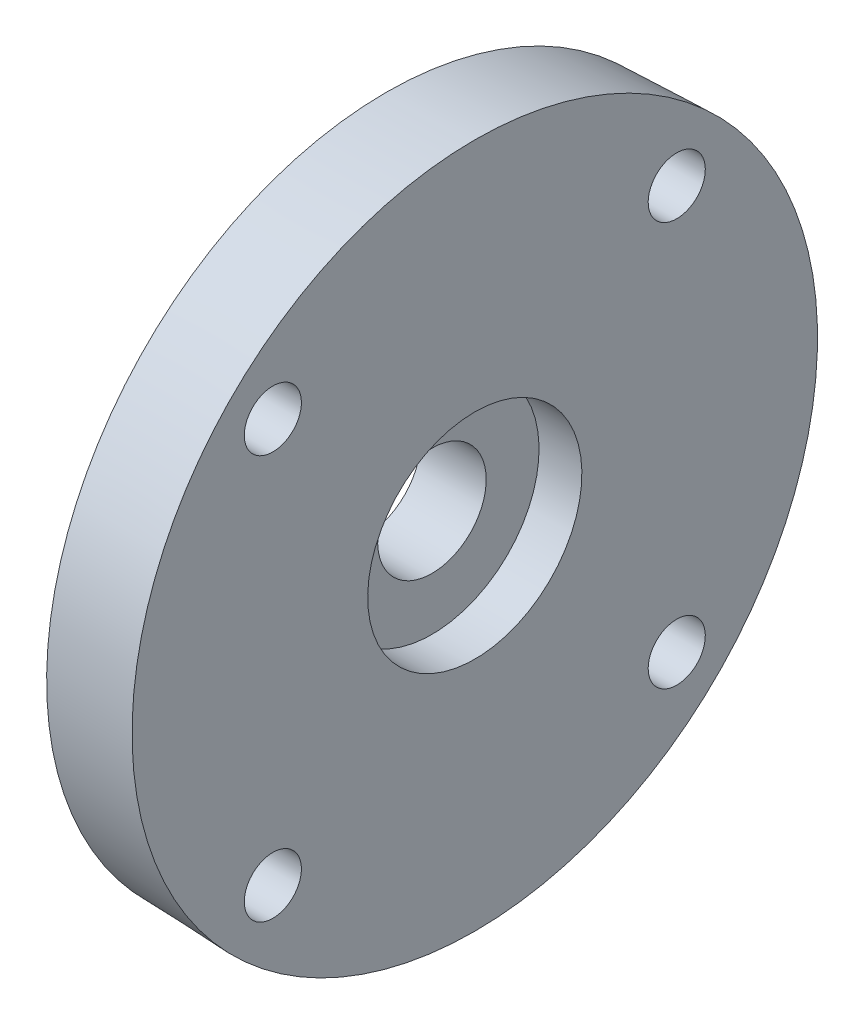
ISO-10303-21;
HEADER;
FILE_DESCRIPTION(('STEP AP214'),'2;1');
FILE_NAME('part.step','',(''),(''),'','','');
FILE_SCHEMA(('AUTOMOTIVE_DESIGN { 1 0 10303 214 1 1 1 1 }'));
ENDSEC;
DATA;
#1=APPLICATION_CONTEXT('core data for automotive mechanical design processes');
#2=APPLICATION_PROTOCOL_DEFINITION('international standard','automotive_design',2000,#1);
#3=PRODUCT_CONTEXT('',#1,'mechanical');
#4=PRODUCT('Part','Part','',(#3));
#5=PRODUCT_RELATED_PRODUCT_CATEGORY('part','',(#4));
#6=PRODUCT_DEFINITION_FORMATION('','',#4);
#7=PRODUCT_DEFINITION_CONTEXT('part definition',#1,'design');
#8=PRODUCT_DEFINITION('design','',#6,#7);
#9=PRODUCT_DEFINITION_SHAPE('','',#8);
#10=(LENGTH_UNIT() NAMED_UNIT(*) SI_UNIT(.MILLI.,.METRE.));
#11=(NAMED_UNIT(*) PLANE_ANGLE_UNIT() SI_UNIT($,.RADIAN.));
#12=(NAMED_UNIT(*) SI_UNIT($,.STERADIAN.) SOLID_ANGLE_UNIT());
#13=UNCERTAINTY_MEASURE_WITH_UNIT(LENGTH_MEASURE(1.E-05),#10,'distance_accuracy_value','');
#14=(GEOMETRIC_REPRESENTATION_CONTEXT(3) GLOBAL_UNCERTAINTY_ASSIGNED_CONTEXT((#13)) GLOBAL_UNIT_ASSIGNED_CONTEXT((#10,
#11,#12)) REPRESENTATION_CONTEXT('',''));
#15=CARTESIAN_POINT('',(0.,0.,0.));
#16=DIRECTION('',(0.,0.,1.));
#17=DIRECTION('',(1.,0.,0.));
#18=AXIS2_PLACEMENT_3D('',#15,#16,#17);
#19=CARTESIAN_POINT('',(0.,0.,0.));
#20=DIRECTION('',(1.,0.,0.));
#21=DIRECTION('',(0.,1.,0.));
#22=AXIS2_PLACEMENT_3D('',#19,#20,#21);
#23=CYLINDRICAL_SURFACE('',#22,4.826);
#24=CARTESIAN_POINT('',(-9.652,0.,0.));
#25=DIRECTION('',(1.,0.,0.));
#26=DIRECTION('',(0.,1.,0.));
#27=AXIS2_PLACEMENT_3D('',#24,#25,#26);
#28=CIRCLE('',#27,4.826);
#29=CARTESIAN_POINT('',(-9.652,4.826,0.));
#30=VERTEX_POINT('',#29);
#31=EDGE_CURVE('E39',#30,#30,#28,.T.);
#32=ORIENTED_EDGE('',*,*,#31,.F.);
#33=EDGE_LOOP('',(#32));
#34=FACE_BOUND('',#33,.T.);
#35=CARTESIAN_POINT('',(-3.81,0.,0.));
#36=DIRECTION('',(1.,0.,0.));
#37=DIRECTION('',(0.,1.,0.));
#38=AXIS2_PLACEMENT_3D('',#35,#36,#37);
#39=CIRCLE('',#38,4.826);
#40=CARTESIAN_POINT('',(-3.81,4.826,0.));
#41=VERTEX_POINT('',#40);
#42=EDGE_CURVE('E35',#41,#41,#39,.T.);
#43=ORIENTED_EDGE('',*,*,#42,.T.);
#44=EDGE_LOOP('',(#43));
#45=FACE_BOUND('',#44,.T.);
#46=ADVANCED_FACE('F31',(#34,#45),#23,.F.);
#47=CARTESIAN_POINT('',(0.,0.,0.));
#48=DIRECTION('',(1.,0.,0.));
#49=DIRECTION('',(0.,1.,0.));
#50=AXIS2_PLACEMENT_3D('',#47,#48,#49);
#51=CONICAL_SURFACE('',#50,30.48,0.03490658503988);
#52=CARTESIAN_POINT('',(-7.874,0.,0.));
#53=DIRECTION('',(1.,0.,0.));
#54=DIRECTION('',(0.,1.,0.));
#55=AXIS2_PLACEMENT_3D('',#52,#53,#54);
#56=CIRCLE('',#55,30.205033861022);
#57=CARTESIAN_POINT('',(-7.874,30.205033861022,0.));
#58=VERTEX_POINT('',#57);
#59=EDGE_CURVE('E51',#58,#58,#56,.T.);
#60=ORIENTED_EDGE('',*,*,#59,.T.);
#61=EDGE_LOOP('',(#60));
#62=FACE_BOUND('',#61,.T.);
#63=CARTESIAN_POINT('',(0.,0.,0.));
#64=DIRECTION('',(1.,0.,0.));
#65=DIRECTION('',(0.,1.,0.));
#66=AXIS2_PLACEMENT_3D('',#63,#64,#65);
#67=CIRCLE('',#66,30.48);
#68=CARTESIAN_POINT('',(0.,30.48,0.));
#69=VERTEX_POINT('',#68);
#70=EDGE_CURVE('E10',#69,#69,#67,.T.);
#71=ORIENTED_EDGE('',*,*,#70,.F.);
#72=EDGE_LOOP('',(#71));
#73=FACE_BOUND('',#72,.T.);
#74=ADVANCED_FACE('F33',(#62,#73),#51,.T.);
#75=CARTESIAN_POINT('',(0.,30.48,0.));
#76=DIRECTION('',(1.,0.,0.));
#77=DIRECTION('',(0.,1.,0.));
#78=AXIS2_PLACEMENT_3D('',#75,#76,#77);
#79=PLANE('',#78);
#80=CARTESIAN_POINT('',(0.,0.,0.));
#81=DIRECTION('',(1.,0.,0.));
#82=DIRECTION('',(0.,1.,0.));
#83=AXIS2_PLACEMENT_3D('',#80,#81,#82);
#84=CIRCLE('',#83,9.525);
#85=CARTESIAN_POINT('',(0.,9.525,0.));
#86=VERTEX_POINT('',#85);
#87=EDGE_CURVE('E78',#86,#86,#84,.T.);
#88=ORIENTED_EDGE('',*,*,#87,.F.);
#89=EDGE_LOOP('',(#88));
#90=FACE_BOUND('',#89,.T.);
#91=CARTESIAN_POINT('',(0.,17.9605122421383,-17.9605122421383));
#92=DIRECTION('',(-1.,0.,0.));
#93=DIRECTION('',(0.,-1.,0.));
#94=AXIS2_PLACEMENT_3D('',#91,#92,#93);
#95=CIRCLE('',#94,2.54);
#96=CARTESIAN_POINT('',(0.,15.4205122421383,-17.9605122421383));
#97=VERTEX_POINT('',#96);
#98=EDGE_CURVE('E58',#97,#97,#95,.T.);
#99=ORIENTED_EDGE('',*,*,#98,.T.);
#100=EDGE_LOOP('',(#99));
#101=FACE_BOUND('',#100,.T.);
#102=CARTESIAN_POINT('',(0.,-17.9605122421383,17.9605122421383));
#103=DIRECTION('',(-1.,0.,0.));
#104=DIRECTION('',(0.,-1.,0.));
#105=AXIS2_PLACEMENT_3D('',#102,#103,#104);
#106=CIRCLE('',#105,2.54);
#107=CARTESIAN_POINT('',(0.,-20.5005122421383,17.9605122421383));
#108=VERTEX_POINT('',#107);
#109=EDGE_CURVE('E64',#108,#108,#106,.T.);
#110=ORIENTED_EDGE('',*,*,#109,.T.);
#111=EDGE_LOOP('',(#110));
#112=FACE_BOUND('',#111,.T.);
#113=CARTESIAN_POINT('',(0.,-17.9605122421383,-17.9605122421383));
#114=DIRECTION('',(-1.,0.,0.));
#115=DIRECTION('',(0.,-1.,0.));
#116=AXIS2_PLACEMENT_3D('',#113,#114,#115);
#117=CIRCLE('',#116,2.54);
#118=CARTESIAN_POINT('',(0.,-20.5005122421383,-17.9605122421383));
#119=VERTEX_POINT('',#118);
#120=EDGE_CURVE('E65',#119,#119,#117,.T.);
#121=ORIENTED_EDGE('',*,*,#120,.T.);
#122=EDGE_LOOP('',(#121));
#123=FACE_BOUND('',#122,.T.);
#124=CARTESIAN_POINT('',(0.,17.9605122421383,17.9605122421383));
#125=DIRECTION('',(-1.,0.,0.));
#126=DIRECTION('',(0.,-1.,0.));
#127=AXIS2_PLACEMENT_3D('',#124,#125,#126);
#128=CIRCLE('',#127,2.54);
#129=CARTESIAN_POINT('',(0.,15.4205122421383,17.9605122421383));
#130=VERTEX_POINT('',#129);
#131=EDGE_CURVE('E54',#130,#130,#128,.T.);
#132=ORIENTED_EDGE('',*,*,#131,.T.);
#133=EDGE_LOOP('',(#132));
#134=FACE_BOUND('',#133,.T.);
#135=ORIENTED_EDGE('',*,*,#70,.T.);
#136=EDGE_LOOP('',(#135));
#137=FACE_BOUND('',#136,.T.);
#138=ADVANCED_FACE('F105',(#90,#101,#112,#123,#134,#137),#79,.T.);
#139=CARTESIAN_POINT('',(-9.652,8.255,0.));
#140=DIRECTION('',(-1.,0.,0.));
#141=DIRECTION('',(0.,-1.,0.));
#142=AXIS2_PLACEMENT_3D('',#139,#140,#141);
#143=PLANE('',#142);
#144=ORIENTED_EDGE('',*,*,#31,.T.);
#145=EDGE_LOOP('',(#144));
#146=FACE_BOUND('',#145,.T.);
#147=CARTESIAN_POINT('',(-9.652,0.,0.));
#148=DIRECTION('',(1.,0.,0.));
#149=DIRECTION('',(0.,1.,0.));
#150=AXIS2_PLACEMENT_3D('',#147,#148,#149);
#151=CIRCLE('',#150,8.255);
#152=CARTESIAN_POINT('',(-9.652,8.255,0.));
#153=VERTEX_POINT('',#152);
#154=EDGE_CURVE('E43',#153,#153,#151,.T.);
#155=ORIENTED_EDGE('',*,*,#154,.F.);
#156=EDGE_LOOP('',(#155));
#157=FACE_BOUND('',#156,.T.);
#158=ADVANCED_FACE('F109',(#146,#157),#143,.T.);
#159=CARTESIAN_POINT('',(0.,0.,0.));
#160=DIRECTION('',(1.,0.,0.));
#161=DIRECTION('',(0.,1.,0.));
#162=AXIS2_PLACEMENT_3D('',#159,#160,#161);
#163=CYLINDRICAL_SURFACE('',#162,8.255);
#164=ORIENTED_EDGE('',*,*,#154,.T.);
#165=EDGE_LOOP('',(#164));
#166=FACE_BOUND('',#165,.T.);
#167=CARTESIAN_POINT('',(-7.874,0.,0.));
#168=DIRECTION('',(1.,0.,0.));
#169=DIRECTION('',(0.,1.,0.));
#170=AXIS2_PLACEMENT_3D('',#167,#168,#169);
#171=CIRCLE('',#170,8.255);
#172=CARTESIAN_POINT('',(-7.874,8.255,0.));
#173=VERTEX_POINT('',#172);
#174=EDGE_CURVE('E48',#173,#173,#171,.T.);
#175=ORIENTED_EDGE('',*,*,#174,.F.);
#176=EDGE_LOOP('',(#175));
#177=FACE_BOUND('',#176,.T.);
#178=ADVANCED_FACE('F116',(#166,#177),#163,.T.);
#179=CARTESIAN_POINT('',(-7.874,8.255,0.));
#180=DIRECTION('',(-1.,0.,0.));
#181=DIRECTION('',(0.,-1.,0.));
#182=AXIS2_PLACEMENT_3D('',#179,#180,#181);
#183=PLANE('',#182);
#184=CARTESIAN_POINT('',(-7.874,17.9605122421383,-17.9605122421383));
#185=DIRECTION('',(-1.,0.,0.));
#186=DIRECTION('',(0.,-1.,0.));
#187=AXIS2_PLACEMENT_3D('',#184,#185,#186);
#188=CIRCLE('',#187,2.54);
#189=CARTESIAN_POINT('',(-7.874,15.4205122421383,-17.9605122421383));
#190=VERTEX_POINT('',#189);
#191=EDGE_CURVE('E68',#190,#190,#188,.T.);
#192=ORIENTED_EDGE('',*,*,#191,.F.);
#193=EDGE_LOOP('',(#192));
#194=FACE_BOUND('',#193,.T.);
#195=CARTESIAN_POINT('',(-7.87399999999999,-17.9605122421383,17.9605122421383));
#196=DIRECTION('',(-1.,0.,0.));
#197=DIRECTION('',(0.,-1.,0.));
#198=AXIS2_PLACEMENT_3D('',#195,#196,#197);
#199=CIRCLE('',#198,2.54);
#200=CARTESIAN_POINT('',(-7.87399999999999,-20.5005122421383,17.9605122421383));
#201=VERTEX_POINT('',#200);
#202=EDGE_CURVE('E61',#201,#201,#199,.T.);
#203=ORIENTED_EDGE('',*,*,#202,.F.);
#204=EDGE_LOOP('',(#203));
#205=FACE_BOUND('',#204,.T.);
#206=CARTESIAN_POINT('',(-7.87399999999999,-17.9605122421383,-17.9605122421383));
#207=DIRECTION('',(-1.,0.,0.));
#208=DIRECTION('',(0.,-1.,0.));
#209=AXIS2_PLACEMENT_3D('',#206,#207,#208);
#210=CIRCLE('',#209,2.54);
#211=CARTESIAN_POINT('',(-7.87399999999999,-20.5005122421383,-17.9605122421383));
#212=VERTEX_POINT('',#211);
#213=EDGE_CURVE('E73',#212,#212,#210,.T.);
#214=ORIENTED_EDGE('',*,*,#213,.F.);
#215=EDGE_LOOP('',(#214));
#216=FACE_BOUND('',#215,.T.);
#217=CARTESIAN_POINT('',(-7.874,17.9605122421383,17.9605122421383));
#218=DIRECTION('',(-1.,0.,0.));
#219=DIRECTION('',(0.,-1.,0.));
#220=AXIS2_PLACEMENT_3D('',#217,#218,#219);
#221=CIRCLE('',#220,2.54);
#222=CARTESIAN_POINT('',(-7.874,15.4205122421383,17.9605122421383));
#223=VERTEX_POINT('',#222);
#224=EDGE_CURVE('E55',#223,#223,#221,.T.);
#225=ORIENTED_EDGE('',*,*,#224,.F.);
#226=EDGE_LOOP('',(#225));
#227=FACE_BOUND('',#226,.T.);
#228=ORIENTED_EDGE('',*,*,#174,.T.);
#229=EDGE_LOOP('',(#228));
#230=FACE_BOUND('',#229,.T.);
#231=ORIENTED_EDGE('',*,*,#59,.F.);
#232=EDGE_LOOP('',(#231));
#233=FACE_BOUND('',#232,.T.);
#234=ADVANCED_FACE('F132',(#194,#205,#216,#227,#230,#233),#183,.T.);
#235=CARTESIAN_POINT('',(0.,17.9605122421383,17.9605122421383));
#236=DIRECTION('',(-1.,0.,0.));
#237=DIRECTION('',(0.,-1.,0.));
#238=AXIS2_PLACEMENT_3D('',#235,#236,#237);
#239=CYLINDRICAL_SURFACE('',#238,2.54);
#240=ORIENTED_EDGE('',*,*,#131,.F.);
#241=EDGE_LOOP('',(#240));
#242=FACE_BOUND('',#241,.T.);
#243=ORIENTED_EDGE('',*,*,#224,.T.);
#244=EDGE_LOOP('',(#243));
#245=FACE_BOUND('',#244,.T.);
#246=ADVANCED_FACE('F128',(#242,#245),#239,.F.);
#247=CARTESIAN_POINT('',(0.,-17.9605122421383,-17.9605122421383));
#248=DIRECTION('',(-1.,0.,0.));
#249=DIRECTION('',(0.,-1.,0.));
#250=AXIS2_PLACEMENT_3D('',#247,#248,#249);
#251=CYLINDRICAL_SURFACE('',#250,2.54);
#252=ORIENTED_EDGE('',*,*,#120,.F.);
#253=EDGE_LOOP('',(#252));
#254=FACE_BOUND('',#253,.T.);
#255=ORIENTED_EDGE('',*,*,#213,.T.);
#256=EDGE_LOOP('',(#255));
#257=FACE_BOUND('',#256,.T.);
#258=ADVANCED_FACE('F131',(#254,#257),#251,.F.);
#259=CARTESIAN_POINT('',(0.,-17.9605122421383,17.9605122421383));
#260=DIRECTION('',(-1.,0.,0.));
#261=DIRECTION('',(0.,-1.,0.));
#262=AXIS2_PLACEMENT_3D('',#259,#260,#261);
#263=CYLINDRICAL_SURFACE('',#262,2.54);
#264=ORIENTED_EDGE('',*,*,#109,.F.);
#265=EDGE_LOOP('',(#264));
#266=FACE_BOUND('',#265,.T.);
#267=ORIENTED_EDGE('',*,*,#202,.T.);
#268=EDGE_LOOP('',(#267));
#269=FACE_BOUND('',#268,.T.);
#270=ADVANCED_FACE('F150',(#266,#269),#263,.F.);
#271=CARTESIAN_POINT('',(0.,17.9605122421383,-17.9605122421383));
#272=DIRECTION('',(-1.,0.,0.));
#273=DIRECTION('',(0.,-1.,0.));
#274=AXIS2_PLACEMENT_3D('',#271,#272,#273);
#275=CYLINDRICAL_SURFACE('',#274,2.54);
#276=ORIENTED_EDGE('',*,*,#98,.F.);
#277=EDGE_LOOP('',(#276));
#278=FACE_BOUND('',#277,.T.);
#279=ORIENTED_EDGE('',*,*,#191,.T.);
#280=EDGE_LOOP('',(#279));
#281=FACE_BOUND('',#280,.T.);
#282=ADVANCED_FACE('F96',(#278,#281),#275,.F.);
#283=CARTESIAN_POINT('',(-3.81,0.,0.));
#284=DIRECTION('',(1.,0.,0.));
#285=DIRECTION('',(0.,1.,0.));
#286=AXIS2_PLACEMENT_3D('',#283,#284,#285);
#287=CYLINDRICAL_SURFACE('',#286,9.525);
#288=CARTESIAN_POINT('',(-3.81,0.,0.));
#289=DIRECTION('',(1.,0.,0.));
#290=DIRECTION('',(0.,1.,0.));
#291=AXIS2_PLACEMENT_3D('',#288,#289,#290);
#292=CIRCLE('',#291,9.525);
#293=CARTESIAN_POINT('',(-3.81,9.525,0.));
#294=VERTEX_POINT('',#293);
#295=EDGE_CURVE('E81',#294,#294,#292,.T.);
#296=CARTESIAN_POINT('',(-3.81,9.525,0.));
#297=CARTESIAN_POINT('',(-3.7703125,9.525,0.));
#298=CARTESIAN_POINT('',(-3.730625,9.525,0.));
#299=CARTESIAN_POINT('',(-3.65125,9.525,0.));
#300=CARTESIAN_POINT('',(-3.6115625,9.525,0.));
#301=CARTESIAN_POINT('',(-3.5321875,9.525,0.));
#302=CARTESIAN_POINT('',(-3.4925,9.525,0.));
#303=CARTESIAN_POINT('',(-3.413125,9.525,0.));
#304=CARTESIAN_POINT('',(-3.3734375,9.525,0.));
#305=CARTESIAN_POINT('',(-3.2940625,9.525,0.));
#306=CARTESIAN_POINT('',(-3.254375,9.525,0.));
#307=CARTESIAN_POINT('',(-3.175,9.525,0.));
#308=CARTESIAN_POINT('',(-3.1353125,9.525,0.));
#309=CARTESIAN_POINT('',(-3.0559375,9.525,0.));
#310=CARTESIAN_POINT('',(-3.01625,9.525,0.));
#311=CARTESIAN_POINT('',(-2.936875,9.525,0.));
#312=CARTESIAN_POINT('',(-2.8971875,9.525,0.));
#313=CARTESIAN_POINT('',(-2.8178125,9.525,0.));
#314=CARTESIAN_POINT('',(-2.778125,9.525,0.));
#315=CARTESIAN_POINT('',(-2.69875,9.525,0.));
#316=CARTESIAN_POINT('',(-2.6590625,9.525,0.));
#317=CARTESIAN_POINT('',(-2.5796875,9.525,0.));
#318=CARTESIAN_POINT('',(-2.54,9.525,0.));
#319=CARTESIAN_POINT('',(-2.460625,9.525,0.));
#320=CARTESIAN_POINT('',(-2.4209375,9.525,0.));
#321=CARTESIAN_POINT('',(-2.3415625,9.525,0.));
#322=CARTESIAN_POINT('',(-2.301875,9.525,0.));
#323=CARTESIAN_POINT('',(-2.2225,9.525,0.));
#324=CARTESIAN_POINT('',(-2.1828125,9.525,0.));
#325=CARTESIAN_POINT('',(-2.1034375,9.525,0.));
#326=CARTESIAN_POINT('',(-2.06375,9.525,0.));
#327=CARTESIAN_POINT('',(-1.984375,9.525,0.));
#328=CARTESIAN_POINT('',(-1.9446875,9.525,0.));
#329=CARTESIAN_POINT('',(-1.8653125,9.525,0.));
#330=CARTESIAN_POINT('',(-1.825625,9.525,0.));
#331=CARTESIAN_POINT('',(-1.74625,9.525,0.));
#332=CARTESIAN_POINT('',(-1.7065625,9.525,0.));
#333=CARTESIAN_POINT('',(-1.6271875,9.525,0.));
#334=CARTESIAN_POINT('',(-1.5875,9.525,0.));
#335=CARTESIAN_POINT('',(-1.508125,9.525,0.));
#336=CARTESIAN_POINT('',(-1.4684375,9.525,0.));
#337=CARTESIAN_POINT('',(-1.3890625,9.525,0.));
#338=CARTESIAN_POINT('',(-1.349375,9.525,0.));
#339=CARTESIAN_POINT('',(-1.27,9.525,0.));
#340=CARTESIAN_POINT('',(-1.2303125,9.525,0.));
#341=CARTESIAN_POINT('',(-1.1509375,9.525,0.));
#342=CARTESIAN_POINT('',(-1.11125,9.525,0.));
#343=CARTESIAN_POINT('',(-1.031875,9.525,0.));
#344=CARTESIAN_POINT('',(-0.992187500000002,9.525,0.));
#345=CARTESIAN_POINT('',(-0.912812500000001,9.525,0.));
#346=CARTESIAN_POINT('',(-0.873125000000001,9.525,0.));
#347=CARTESIAN_POINT('',(-0.793750000000001,9.525,0.));
#348=CARTESIAN_POINT('',(-0.754062500000002,9.525,0.));
#349=CARTESIAN_POINT('',(-0.674687500000001,9.525,0.));
#350=CARTESIAN_POINT('',(-0.635000000000001,9.525,0.));
#351=CARTESIAN_POINT('',(-0.555625000000001,9.525,0.));
#352=CARTESIAN_POINT('',(-0.515937500000001,9.525,0.));
#353=CARTESIAN_POINT('',(-0.436562500000001,9.525,0.));
#354=CARTESIAN_POINT('',(-0.396875000000001,9.525,0.));
#355=CARTESIAN_POINT('',(-0.317500000000001,9.525,0.));
#356=CARTESIAN_POINT('',(-0.277812500000001,9.525,0.));
#357=CARTESIAN_POINT('',(-0.198437500000001,9.525,0.));
#358=CARTESIAN_POINT('',(-0.158750000000001,9.525,0.));
#359=CARTESIAN_POINT('',(-0.0793750000000012,9.525,0.));
#360=CARTESIAN_POINT('',(-0.0396875000000012,9.525,0.));
#361=CARTESIAN_POINT('',(0.,9.525,0.));
#362=B_SPLINE_CURVE_WITH_KNOTS('',3,(#296,#297,#298,#299,#300,#301,#302,#303,#304,#305,#306,
#307,#308,#309,#310,#311,#312,#313,#314,#315,#316,#317,#318,#319,#320,#321,#322,#323,#324,#325,
#326,#327,#328,#329,#330,#331,#332,#333,#334,#335,#336,#337,#338,#339,#340,#341,#342,#343,#344,
#345,#346,#347,#348,#349,#350,#351,#352,#353,#354,#355,#356,#357,#358,#359,#360,#361),
.UNSPECIFIED.,.F.,.F.,(4,2,2,2,2,2,2,2,2,2,2,2,2,2,2,2,2,2,2,2,2,2,2,2,2,2,2,2,2,2,2,2,4),(0.,
0.1190625,0.238125,0.3571875,0.47625,0.5953125,0.714375,0.8334375,0.9525,1.0715625,1.190625,
1.3096875,1.42875,1.5478125,1.666875,1.7859375,1.905,2.0240625,2.143125,2.2621875,2.38125,
2.5003125,2.619375,2.7384375,2.8575,2.9765625,3.095625,3.2146875,3.33375,3.4528125,3.571875,
3.6909375,3.81),.UNSPECIFIED.);
#363=EDGE_CURVE('BSEAM91',#294,#86,#362,.T.);
#364=ORIENTED_EDGE('',*,*,#295,.F.);
#365=ORIENTED_EDGE('',*,*,#87,.T.);
#366=ORIENTED_EDGE('',*,*,#363,.T.);
#367=ORIENTED_EDGE('',*,*,#363,.F.);
#368=EDGE_LOOP('',(#364,#366,#365,#367));
#369=FACE_BOUND('',#368,.T.);
#370=ADVANCED_FACE('F91',(#369),#287,.F.);
#371=CARTESIAN_POINT('',(-3.81,0.,0.));
#372=DIRECTION('',(1.,0.,0.));
#373=DIRECTION('',(0.,1.,0.));
#374=AXIS2_PLACEMENT_3D('',#371,#372,#373);
#375=PLANE('',#374);
#376=ORIENTED_EDGE('',*,*,#42,.F.);
#377=EDGE_LOOP('',(#376));
#378=FACE_BOUND('',#377,.T.);
#379=ORIENTED_EDGE('',*,*,#295,.T.);
#380=EDGE_LOOP('',(#379));
#381=FACE_BOUND('',#380,.T.);
#382=ADVANCED_FACE('F89',(#378,#381),#375,.T.);
#383=CLOSED_SHELL('',(#46,#74,#138,#158,#178,#234,#246,#258,#270,#282,#370,#382));
#384=MANIFOLD_SOLID_BREP('B2',#383);
#385=ADVANCED_BREP_SHAPE_REPRESENTATION('',(#18,#384),#14);
#386=SHAPE_DEFINITION_REPRESENTATION(#9,#385);
ENDSEC;
END-ISO-10303-21;
